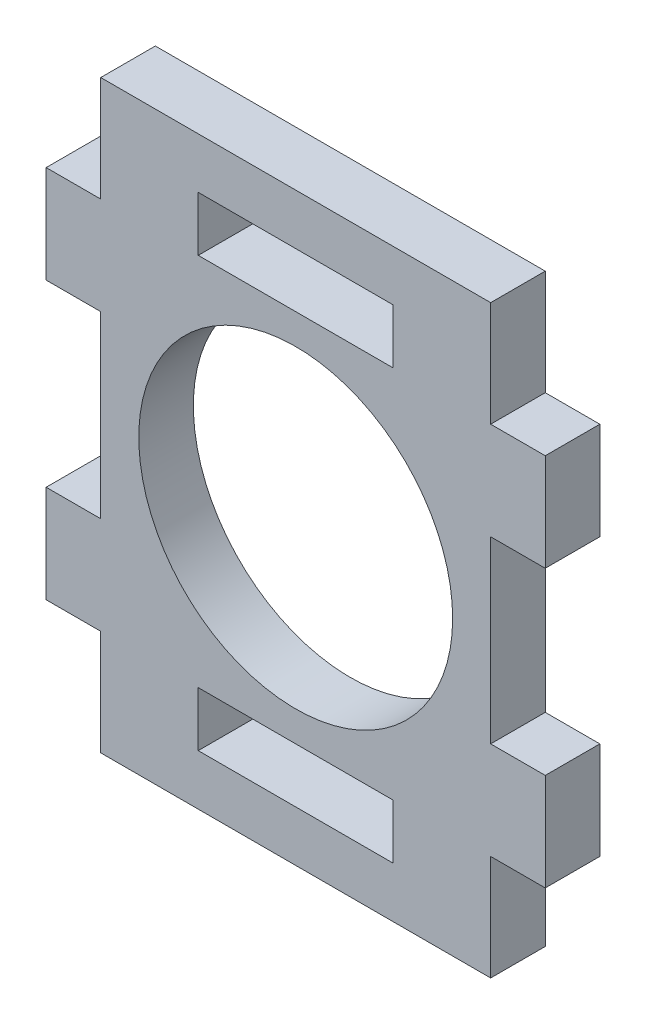
ISO-10303-21;
HEADER;
FILE_DESCRIPTION(('STEP AP214'),'2;1');
FILE_NAME('part.step','',(''),(''),'','','');
FILE_SCHEMA(('AUTOMOTIVE_DESIGN { 1 0 10303 214 1 1 1 1 }'));
ENDSEC;
DATA;
#1=APPLICATION_CONTEXT('core data for automotive mechanical design processes');
#2=APPLICATION_PROTOCOL_DEFINITION('international standard','automotive_design',2000,#1);
#3=PRODUCT_CONTEXT('',#1,'mechanical');
#4=PRODUCT('Part','Part','',(#3));
#5=PRODUCT_RELATED_PRODUCT_CATEGORY('part','',(#4));
#6=PRODUCT_DEFINITION_FORMATION('','',#4);
#7=PRODUCT_DEFINITION_CONTEXT('part definition',#1,'design');
#8=PRODUCT_DEFINITION('design','',#6,#7);
#9=PRODUCT_DEFINITION_SHAPE('','',#8);
#10=(LENGTH_UNIT() NAMED_UNIT(*) SI_UNIT(.MILLI.,.METRE.));
#11=(NAMED_UNIT(*) PLANE_ANGLE_UNIT() SI_UNIT($,.RADIAN.));
#12=(NAMED_UNIT(*) SI_UNIT($,.STERADIAN.) SOLID_ANGLE_UNIT());
#13=UNCERTAINTY_MEASURE_WITH_UNIT(LENGTH_MEASURE(1.E-05),#10,'distance_accuracy_value','');
#14=(GEOMETRIC_REPRESENTATION_CONTEXT(3) GLOBAL_UNCERTAINTY_ASSIGNED_CONTEXT((#13)) GLOBAL_UNIT_ASSIGNED_CONTEXT((#10,
#11,#12)) REPRESENTATION_CONTEXT('',''));
#15=CARTESIAN_POINT('',(0.,0.,0.));
#16=DIRECTION('',(0.,0.,1.));
#17=DIRECTION('',(1.,0.,0.));
#18=AXIS2_PLACEMENT_3D('',#15,#16,#17);
#19=CARTESIAN_POINT('',(0.,0.,1.4));
#20=DIRECTION('',(0.,0.,-1.));
#21=DIRECTION('',(-1.,0.,0.));
#22=AXIS2_PLACEMENT_3D('',#19,#20,#21);
#23=PLANE('',#22);
#24=DIRECTION('',(0.,-1.,0.));
#25=VECTOR('',#24,1.);
#26=CARTESIAN_POINT('',(-5.,9.6,1.4));
#27=LINE('',#26,#25);
#28=CARTESIAN_POINT('',(-5.,12.4,1.4));
#29=VERTEX_POINT('',#28);
#30=CARTESIAN_POINT('',(-5.,9.6,1.4));
#31=VERTEX_POINT('',#30);
#32=EDGE_CURVE('E252',#29,#31,#27,.T.);
#33=ORIENTED_EDGE('',*,*,#32,.F.);
#34=DIRECTION('',(-1.,0.,0.));
#35=VECTOR('',#34,1.);
#36=CARTESIAN_POINT('',(5.,12.4,1.4));
#37=LINE('',#36,#35);
#38=CARTESIAN_POINT('',(5.,12.4,1.4));
#39=VERTEX_POINT('',#38);
#40=EDGE_CURVE('E260',#39,#29,#37,.T.);
#41=ORIENTED_EDGE('',*,*,#40,.F.);
#42=DIRECTION('',(0.,1.,0.));
#43=VECTOR('',#42,1.);
#44=CARTESIAN_POINT('',(5.,9.6,1.4));
#45=LINE('',#44,#43);
#46=CARTESIAN_POINT('',(5.,9.6,1.4));
#47=VERTEX_POINT('',#46);
#48=EDGE_CURVE('E257',#47,#39,#45,.T.);
#49=ORIENTED_EDGE('',*,*,#48,.F.);
#50=DIRECTION('',(1.,0.,0.));
#51=VECTOR('',#50,1.);
#52=CARTESIAN_POINT('',(5.,9.6,1.4));
#53=LINE('',#52,#51);
#54=EDGE_CURVE('E254',#31,#47,#53,.T.);
#55=ORIENTED_EDGE('',*,*,#54,.F.);
#56=EDGE_LOOP('',(#33,#41,#49,#55));
#57=FACE_BOUND('',#56,.T.);
#58=DIRECTION('',(0.,1.,0.));
#59=VECTOR('',#58,1.);
#60=CARTESIAN_POINT('',(10.,9.6,1.4));
#61=LINE('',#60,#59);
#62=CARTESIAN_POINT('',(10.,9.6,1.4));
#63=VERTEX_POINT('',#62);
#64=CARTESIAN_POINT('',(10.,15.,1.4));
#65=VERTEX_POINT('',#64);
#66=EDGE_CURVE('E289',#63,#65,#61,.T.);
#67=ORIENTED_EDGE('',*,*,#66,.T.);
#68=DIRECTION('',(-1.,0.,0.));
#69=VECTOR('',#68,1.);
#70=CARTESIAN_POINT('',(-10.,15.,1.4));
#71=LINE('',#70,#69);
#72=CARTESIAN_POINT('',(-10.,15.,1.4));
#73=VERTEX_POINT('',#72);
#74=EDGE_CURVE('E292',#65,#73,#71,.T.);
#75=ORIENTED_EDGE('',*,*,#74,.T.);
#76=DIRECTION('',(0.,-1.,0.));
#77=VECTOR('',#76,1.);
#78=CARTESIAN_POINT('',(-10.,9.6,1.4));
#79=LINE('',#78,#77);
#80=CARTESIAN_POINT('',(-10.,9.6,1.4));
#81=VERTEX_POINT('',#80);
#82=EDGE_CURVE('E295',#73,#81,#79,.T.);
#83=ORIENTED_EDGE('',*,*,#82,.T.);
#84=DIRECTION('',(-1.,0.,0.));
#85=VECTOR('',#84,1.);
#86=CARTESIAN_POINT('',(-10.,9.6,1.4));
#87=LINE('',#86,#85);
#88=CARTESIAN_POINT('',(-12.8,9.6,1.4));
#89=VERTEX_POINT('',#88);
#90=EDGE_CURVE('E297',#81,#89,#87,.T.);
#91=ORIENTED_EDGE('',*,*,#90,.T.);
#92=DIRECTION('',(0.,-1.,0.));
#93=VECTOR('',#92,1.);
#94=CARTESIAN_POINT('',(-12.8,9.6,1.4));
#95=LINE('',#94,#93);
#96=CARTESIAN_POINT('',(-12.8,4.6,1.4));
#97=VERTEX_POINT('',#96);
#98=EDGE_CURVE('E299',#89,#97,#95,.T.);
#99=ORIENTED_EDGE('',*,*,#98,.T.);
#100=DIRECTION('',(1.,0.,0.));
#101=VECTOR('',#100,1.);
#102=CARTESIAN_POINT('',(-12.8,4.6,1.4));
#103=LINE('',#102,#101);
#104=CARTESIAN_POINT('',(-10.,4.6,1.4));
#105=VERTEX_POINT('',#104);
#106=EDGE_CURVE('E301',#97,#105,#103,.T.);
#107=ORIENTED_EDGE('',*,*,#106,.T.);
#108=DIRECTION('',(0.,-1.,0.));
#109=VECTOR('',#108,1.);
#110=CARTESIAN_POINT('',(-10.,-4.6,1.4));
#111=LINE('',#110,#109);
#112=CARTESIAN_POINT('',(-10.,-4.6,1.4));
#113=VERTEX_POINT('',#112);
#114=EDGE_CURVE('E303',#105,#113,#111,.T.);
#115=ORIENTED_EDGE('',*,*,#114,.T.);
#116=DIRECTION('',(-1.,0.,0.));
#117=VECTOR('',#116,1.);
#118=CARTESIAN_POINT('',(-12.8,-4.6,1.4));
#119=LINE('',#118,#117);
#120=CARTESIAN_POINT('',(-12.8,-4.6,1.4));
#121=VERTEX_POINT('',#120);
#122=EDGE_CURVE('E305',#113,#121,#119,.T.);
#123=ORIENTED_EDGE('',*,*,#122,.T.);
#124=DIRECTION('',(0.,-1.,0.));
#125=VECTOR('',#124,1.);
#126=CARTESIAN_POINT('',(-12.8,-9.60000000000001,1.4));
#127=LINE('',#126,#125);
#128=CARTESIAN_POINT('',(-12.8,-9.60000000000001,1.4));
#129=VERTEX_POINT('',#128);
#130=EDGE_CURVE('E307',#121,#129,#127,.T.);
#131=ORIENTED_EDGE('',*,*,#130,.T.);
#132=DIRECTION('',(1.,0.,0.));
#133=VECTOR('',#132,1.);
#134=CARTESIAN_POINT('',(-10.,-9.6,1.4));
#135=LINE('',#134,#133);
#136=CARTESIAN_POINT('',(-10.,-9.6,1.4));
#137=VERTEX_POINT('',#136);
#138=EDGE_CURVE('E309',#129,#137,#135,.T.);
#139=ORIENTED_EDGE('',*,*,#138,.T.);
#140=DIRECTION('',(0.,-1.,0.));
#141=VECTOR('',#140,1.);
#142=CARTESIAN_POINT('',(-10.,-15.,1.4));
#143=LINE('',#142,#141);
#144=CARTESIAN_POINT('',(-10.,-15.,1.4));
#145=VERTEX_POINT('',#144);
#146=EDGE_CURVE('E311',#137,#145,#143,.T.);
#147=ORIENTED_EDGE('',*,*,#146,.T.);
#148=DIRECTION('',(1.,0.,0.));
#149=VECTOR('',#148,1.);
#150=CARTESIAN_POINT('',(-10.,-15.,1.4));
#151=LINE('',#150,#149);
#152=CARTESIAN_POINT('',(10.,-15.,1.4));
#153=VERTEX_POINT('',#152);
#154=EDGE_CURVE('E313',#145,#153,#151,.T.);
#155=ORIENTED_EDGE('',*,*,#154,.T.);
#156=DIRECTION('',(0.,1.,0.));
#157=VECTOR('',#156,1.);
#158=CARTESIAN_POINT('',(10.,-15.,1.4));
#159=LINE('',#158,#157);
#160=CARTESIAN_POINT('',(10.,-9.6,1.4));
#161=VERTEX_POINT('',#160);
#162=EDGE_CURVE('E315',#153,#161,#159,.T.);
#163=ORIENTED_EDGE('',*,*,#162,.T.);
#164=DIRECTION('',(1.,0.,0.));
#165=VECTOR('',#164,1.);
#166=CARTESIAN_POINT('',(10.,-9.6,1.4));
#167=LINE('',#166,#165);
#168=CARTESIAN_POINT('',(12.8,-9.6,1.4));
#169=VERTEX_POINT('',#168);
#170=EDGE_CURVE('E317',#161,#169,#167,.T.);
#171=ORIENTED_EDGE('',*,*,#170,.T.);
#172=DIRECTION('',(0.,1.,0.));
#173=VECTOR('',#172,1.);
#174=CARTESIAN_POINT('',(12.8,-9.6,1.4));
#175=LINE('',#174,#173);
#176=CARTESIAN_POINT('',(12.8,-4.6,1.4));
#177=VERTEX_POINT('',#176);
#178=EDGE_CURVE('E319',#169,#177,#175,.T.);
#179=ORIENTED_EDGE('',*,*,#178,.T.);
#180=DIRECTION('',(-1.,0.,0.));
#181=VECTOR('',#180,1.);
#182=CARTESIAN_POINT('',(12.8,-4.6,1.4));
#183=LINE('',#182,#181);
#184=CARTESIAN_POINT('',(10.,-4.6,1.4));
#185=VERTEX_POINT('',#184);
#186=EDGE_CURVE('E321',#177,#185,#183,.T.);
#187=ORIENTED_EDGE('',*,*,#186,.T.);
#188=DIRECTION('',(0.,1.,0.));
#189=VECTOR('',#188,1.);
#190=CARTESIAN_POINT('',(10.,-4.6,1.4));
#191=LINE('',#190,#189);
#192=CARTESIAN_POINT('',(10.,4.6,1.4));
#193=VERTEX_POINT('',#192);
#194=EDGE_CURVE('E323',#185,#193,#191,.T.);
#195=ORIENTED_EDGE('',*,*,#194,.T.);
#196=DIRECTION('',(1.,0.,0.));
#197=VECTOR('',#196,1.);
#198=CARTESIAN_POINT('',(12.8,4.6,1.4));
#199=LINE('',#198,#197);
#200=CARTESIAN_POINT('',(12.8,4.6,1.4));
#201=VERTEX_POINT('',#200);
#202=EDGE_CURVE('E325',#193,#201,#199,.T.);
#203=ORIENTED_EDGE('',*,*,#202,.T.);
#204=DIRECTION('',(0.,1.,0.));
#205=VECTOR('',#204,1.);
#206=CARTESIAN_POINT('',(12.8,9.6,1.4));
#207=LINE('',#206,#205);
#208=CARTESIAN_POINT('',(12.8,9.6,1.4));
#209=VERTEX_POINT('',#208);
#210=EDGE_CURVE('E327',#201,#209,#207,.T.);
#211=ORIENTED_EDGE('',*,*,#210,.T.);
#212=DIRECTION('',(-1.,0.,0.));
#213=VECTOR('',#212,1.);
#214=CARTESIAN_POINT('',(10.,9.6,1.4));
#215=LINE('',#214,#213);
#216=EDGE_CURVE('E329',#209,#63,#215,.T.);
#217=ORIENTED_EDGE('',*,*,#216,.T.);
#218=EDGE_LOOP('',(#67,#75,#83,#91,#99,#107,#115,#123,#131,#139,#147,#155,#163,#171,#179,#187,
#195,#203,#211,#217));
#219=FACE_BOUND('',#218,.T.);
#220=CARTESIAN_POINT('',(0.,0.,1.4));
#221=DIRECTION('',(0.,0.,1.));
#222=DIRECTION('',(1.,0.,0.));
#223=AXIS2_PLACEMENT_3D('',#220,#221,#222);
#224=CIRCLE('',#223,8.05);
#225=CARTESIAN_POINT('',(8.05,0.,1.4));
#226=VERTEX_POINT('',#225);
#227=EDGE_CURVE('E283',#226,#226,#224,.T.);
#228=ORIENTED_EDGE('',*,*,#227,.F.);
#229=EDGE_LOOP('',(#228));
#230=FACE_BOUND('',#229,.T.);
#231=DIRECTION('',(0.,1.,0.));
#232=VECTOR('',#231,1.);
#233=CARTESIAN_POINT('',(4.99999999999998,-9.6,1.4));
#234=LINE('',#233,#232);
#235=CARTESIAN_POINT('',(4.99999999999998,-12.4,1.4));
#236=VERTEX_POINT('',#235);
#237=CARTESIAN_POINT('',(4.99999999999998,-9.6,1.4));
#238=VERTEX_POINT('',#237);
#239=EDGE_CURVE('E216',#236,#238,#234,.T.);
#240=ORIENTED_EDGE('',*,*,#239,.F.);
#241=DIRECTION('',(1.,0.,0.));
#242=VECTOR('',#241,1.);
#243=CARTESIAN_POINT('',(4.99999999999998,-12.4,1.4));
#244=LINE('',#243,#242);
#245=CARTESIAN_POINT('',(-5.00000000000002,-12.4,1.4));
#246=VERTEX_POINT('',#245);
#247=EDGE_CURVE('E238',#246,#236,#244,.T.);
#248=ORIENTED_EDGE('',*,*,#247,.F.);
#249=DIRECTION('',(0.,-1.,0.));
#250=VECTOR('',#249,1.);
#251=CARTESIAN_POINT('',(-5.00000000000002,-9.6,1.4));
#252=LINE('',#251,#250);
#253=CARTESIAN_POINT('',(-5.00000000000002,-9.6,1.4));
#254=VERTEX_POINT('',#253);
#255=EDGE_CURVE('E236',#254,#246,#252,.T.);
#256=ORIENTED_EDGE('',*,*,#255,.F.);
#257=DIRECTION('',(-1.,0.,0.));
#258=VECTOR('',#257,1.);
#259=CARTESIAN_POINT('',(4.99999999999998,-9.6,1.4));
#260=LINE('',#259,#258);
#261=EDGE_CURVE('E224',#238,#254,#260,.T.);
#262=ORIENTED_EDGE('',*,*,#261,.F.);
#263=EDGE_LOOP('',(#240,#248,#256,#262));
#264=FACE_BOUND('',#263,.T.);
#265=ADVANCED_FACE('F31',(#57,#219,#230,#264),#23,.F.);
#266=CARTESIAN_POINT('',(0.,0.,-1.4));
#267=DIRECTION('',(0.,0.,-1.));
#268=DIRECTION('',(-1.,0.,0.));
#269=AXIS2_PLACEMENT_3D('',#266,#267,#268);
#270=PLANE('',#269);
#271=DIRECTION('',(0.,1.,0.));
#272=VECTOR('',#271,1.);
#273=CARTESIAN_POINT('',(10.,9.6,-1.4));
#274=LINE('',#273,#272);
#275=CARTESIAN_POINT('',(10.,9.6,-1.4));
#276=VERTEX_POINT('',#275);
#277=CARTESIAN_POINT('',(10.,15.,-1.4));
#278=VERTEX_POINT('',#277);
#279=EDGE_CURVE('E286',#276,#278,#274,.T.);
#280=ORIENTED_EDGE('',*,*,#279,.F.);
#281=DIRECTION('',(-1.,0.,0.));
#282=VECTOR('',#281,1.);
#283=CARTESIAN_POINT('',(10.,9.6,-1.4));
#284=LINE('',#283,#282);
#285=CARTESIAN_POINT('',(12.8,9.6,-1.4));
#286=VERTEX_POINT('',#285);
#287=EDGE_CURVE('E293',#286,#276,#284,.T.);
#288=ORIENTED_EDGE('',*,*,#287,.F.);
#289=DIRECTION('',(0.,1.,0.));
#290=VECTOR('',#289,1.);
#291=CARTESIAN_POINT('',(12.8,9.6,-1.4));
#292=LINE('',#291,#290);
#293=CARTESIAN_POINT('',(12.8,4.6,-1.4));
#294=VERTEX_POINT('',#293);
#295=EDGE_CURVE('E368',#294,#286,#292,.T.);
#296=ORIENTED_EDGE('',*,*,#295,.F.);
#297=DIRECTION('',(1.,0.,0.));
#298=VECTOR('',#297,1.);
#299=CARTESIAN_POINT('',(12.8,4.6,-1.4));
#300=LINE('',#299,#298);
#301=CARTESIAN_POINT('',(10.,4.6,-1.4));
#302=VERTEX_POINT('',#301);
#303=EDGE_CURVE('E366',#302,#294,#300,.T.);
#304=ORIENTED_EDGE('',*,*,#303,.F.);
#305=DIRECTION('',(0.,1.,0.));
#306=VECTOR('',#305,1.);
#307=CARTESIAN_POINT('',(10.,-4.6,-1.4));
#308=LINE('',#307,#306);
#309=CARTESIAN_POINT('',(10.,-4.6,-1.4));
#310=VERTEX_POINT('',#309);
#311=EDGE_CURVE('E364',#310,#302,#308,.T.);
#312=ORIENTED_EDGE('',*,*,#311,.F.);
#313=DIRECTION('',(-1.,0.,0.));
#314=VECTOR('',#313,1.);
#315=CARTESIAN_POINT('',(12.8,-4.6,-1.4));
#316=LINE('',#315,#314);
#317=CARTESIAN_POINT('',(12.8,-4.6,-1.4));
#318=VERTEX_POINT('',#317);
#319=EDGE_CURVE('E362',#318,#310,#316,.T.);
#320=ORIENTED_EDGE('',*,*,#319,.F.);
#321=DIRECTION('',(0.,1.,0.));
#322=VECTOR('',#321,1.);
#323=CARTESIAN_POINT('',(12.8,-9.6,-1.4));
#324=LINE('',#323,#322);
#325=CARTESIAN_POINT('',(12.8,-9.6,-1.4));
#326=VERTEX_POINT('',#325);
#327=EDGE_CURVE('E360',#326,#318,#324,.T.);
#328=ORIENTED_EDGE('',*,*,#327,.F.);
#329=DIRECTION('',(1.,0.,0.));
#330=VECTOR('',#329,1.);
#331=CARTESIAN_POINT('',(10.,-9.6,-1.4));
#332=LINE('',#331,#330);
#333=CARTESIAN_POINT('',(10.,-9.6,-1.4));
#334=VERTEX_POINT('',#333);
#335=EDGE_CURVE('E358',#334,#326,#332,.T.);
#336=ORIENTED_EDGE('',*,*,#335,.F.);
#337=DIRECTION('',(0.,1.,0.));
#338=VECTOR('',#337,1.);
#339=CARTESIAN_POINT('',(10.,-15.,-1.4));
#340=LINE('',#339,#338);
#341=CARTESIAN_POINT('',(10.,-15.,-1.4));
#342=VERTEX_POINT('',#341);
#343=EDGE_CURVE('E356',#342,#334,#340,.T.);
#344=ORIENTED_EDGE('',*,*,#343,.F.);
#345=DIRECTION('',(1.,0.,0.));
#346=VECTOR('',#345,1.);
#347=CARTESIAN_POINT('',(-10.,-15.,-1.4));
#348=LINE('',#347,#346);
#349=CARTESIAN_POINT('',(-10.,-15.,-1.4));
#350=VERTEX_POINT('',#349);
#351=EDGE_CURVE('E354',#350,#342,#348,.T.);
#352=ORIENTED_EDGE('',*,*,#351,.F.);
#353=DIRECTION('',(0.,-1.,0.));
#354=VECTOR('',#353,1.);
#355=CARTESIAN_POINT('',(-10.,-15.,-1.4));
#356=LINE('',#355,#354);
#357=CARTESIAN_POINT('',(-10.,-9.6,-1.4));
#358=VERTEX_POINT('',#357);
#359=EDGE_CURVE('E352',#358,#350,#356,.T.);
#360=ORIENTED_EDGE('',*,*,#359,.F.);
#361=DIRECTION('',(1.,0.,0.));
#362=VECTOR('',#361,1.);
#363=CARTESIAN_POINT('',(-10.,-9.6,-1.4));
#364=LINE('',#363,#362);
#365=CARTESIAN_POINT('',(-12.8,-9.60000000000001,-1.4));
#366=VERTEX_POINT('',#365);
#367=EDGE_CURVE('E350',#366,#358,#364,.T.);
#368=ORIENTED_EDGE('',*,*,#367,.F.);
#369=DIRECTION('',(0.,-1.,0.));
#370=VECTOR('',#369,1.);
#371=CARTESIAN_POINT('',(-12.8,-9.60000000000001,-1.4));
#372=LINE('',#371,#370);
#373=CARTESIAN_POINT('',(-12.8,-4.6,-1.4));
#374=VERTEX_POINT('',#373);
#375=EDGE_CURVE('E348',#374,#366,#372,.T.);
#376=ORIENTED_EDGE('',*,*,#375,.F.);
#377=DIRECTION('',(-1.,0.,0.));
#378=VECTOR('',#377,1.);
#379=CARTESIAN_POINT('',(-12.8,-4.6,-1.4));
#380=LINE('',#379,#378);
#381=CARTESIAN_POINT('',(-10.,-4.6,-1.4));
#382=VERTEX_POINT('',#381);
#383=EDGE_CURVE('E346',#382,#374,#380,.T.);
#384=ORIENTED_EDGE('',*,*,#383,.F.);
#385=DIRECTION('',(0.,-1.,0.));
#386=VECTOR('',#385,1.);
#387=CARTESIAN_POINT('',(-10.,-4.6,-1.4));
#388=LINE('',#387,#386);
#389=CARTESIAN_POINT('',(-10.,4.6,-1.4));
#390=VERTEX_POINT('',#389);
#391=EDGE_CURVE('E344',#390,#382,#388,.T.);
#392=ORIENTED_EDGE('',*,*,#391,.F.);
#393=DIRECTION('',(1.,0.,0.));
#394=VECTOR('',#393,1.);
#395=CARTESIAN_POINT('',(-12.8,4.6,-1.4));
#396=LINE('',#395,#394);
#397=CARTESIAN_POINT('',(-12.8,4.6,-1.4));
#398=VERTEX_POINT('',#397);
#399=EDGE_CURVE('E342',#398,#390,#396,.T.);
#400=ORIENTED_EDGE('',*,*,#399,.F.);
#401=DIRECTION('',(0.,-1.,0.));
#402=VECTOR('',#401,1.);
#403=CARTESIAN_POINT('',(-12.8,9.6,-1.4));
#404=LINE('',#403,#402);
#405=CARTESIAN_POINT('',(-12.8,9.6,-1.4));
#406=VERTEX_POINT('',#405);
#407=EDGE_CURVE('E340',#406,#398,#404,.T.);
#408=ORIENTED_EDGE('',*,*,#407,.F.);
#409=DIRECTION('',(-1.,0.,0.));
#410=VECTOR('',#409,1.);
#411=CARTESIAN_POINT('',(-10.,9.6,-1.4));
#412=LINE('',#411,#410);
#413=CARTESIAN_POINT('',(-10.,9.6,-1.4));
#414=VERTEX_POINT('',#413);
#415=EDGE_CURVE('E338',#414,#406,#412,.T.);
#416=ORIENTED_EDGE('',*,*,#415,.F.);
#417=DIRECTION('',(0.,-1.,0.));
#418=VECTOR('',#417,1.);
#419=CARTESIAN_POINT('',(-10.,9.6,-1.4));
#420=LINE('',#419,#418);
#421=CARTESIAN_POINT('',(-10.,15.,-1.4));
#422=VERTEX_POINT('',#421);
#423=EDGE_CURVE('E336',#422,#414,#420,.T.);
#424=ORIENTED_EDGE('',*,*,#423,.F.);
#425=DIRECTION('',(-1.,0.,0.));
#426=VECTOR('',#425,1.);
#427=CARTESIAN_POINT('',(-10.,15.,-1.4));
#428=LINE('',#427,#426);
#429=EDGE_CURVE('E334',#278,#422,#428,.T.);
#430=ORIENTED_EDGE('',*,*,#429,.F.);
#431=EDGE_LOOP('',(#280,#288,#296,#304,#312,#320,#328,#336,#344,#352,#360,#368,#376,#384,#392,
#400,#408,#416,#424,#430));
#432=FACE_BOUND('',#431,.T.);
#433=CARTESIAN_POINT('',(0.,0.,-1.4));
#434=DIRECTION('',(0.,0.,1.));
#435=DIRECTION('',(1.,0.,0.));
#436=AXIS2_PLACEMENT_3D('',#433,#434,#435);
#437=CIRCLE('',#436,8.05);
#438=CARTESIAN_POINT('',(8.05,0.,-1.4));
#439=VERTEX_POINT('',#438);
#440=EDGE_CURVE('E282',#439,#439,#437,.T.);
#441=ORIENTED_EDGE('',*,*,#440,.T.);
#442=EDGE_LOOP('',(#441));
#443=FACE_BOUND('',#442,.T.);
#444=DIRECTION('',(-1.,0.,0.));
#445=VECTOR('',#444,1.);
#446=CARTESIAN_POINT('',(5.,12.4,-1.4));
#447=LINE('',#446,#445);
#448=CARTESIAN_POINT('',(5.,12.4,-1.4));
#449=VERTEX_POINT('',#448);
#450=CARTESIAN_POINT('',(-5.,12.4,-1.4));
#451=VERTEX_POINT('',#450);
#452=EDGE_CURVE('E255',#449,#451,#447,.T.);
#453=ORIENTED_EDGE('',*,*,#452,.T.);
#454=DIRECTION('',(0.,-1.,0.));
#455=VECTOR('',#454,1.);
#456=CARTESIAN_POINT('',(-5.,9.6,-1.4));
#457=LINE('',#456,#455);
#458=CARTESIAN_POINT('',(-5.,9.6,-1.4));
#459=VERTEX_POINT('',#458);
#460=EDGE_CURVE('E232',#451,#459,#457,.T.);
#461=ORIENTED_EDGE('',*,*,#460,.T.);
#462=DIRECTION('',(1.,0.,0.));
#463=VECTOR('',#462,1.);
#464=CARTESIAN_POINT('',(5.,9.6,-1.4));
#465=LINE('',#464,#463);
#466=CARTESIAN_POINT('',(5.,9.6,-1.4));
#467=VERTEX_POINT('',#466);
#468=EDGE_CURVE('E265',#459,#467,#465,.T.);
#469=ORIENTED_EDGE('',*,*,#468,.T.);
#470=DIRECTION('',(0.,1.,0.));
#471=VECTOR('',#470,1.);
#472=CARTESIAN_POINT('',(5.,9.6,-1.4));
#473=LINE('',#472,#471);
#474=EDGE_CURVE('E268',#467,#449,#473,.T.);
#475=ORIENTED_EDGE('',*,*,#474,.T.);
#476=EDGE_LOOP('',(#453,#461,#469,#475));
#477=FACE_BOUND('',#476,.T.);
#478=DIRECTION('',(1.,0.,0.));
#479=VECTOR('',#478,1.);
#480=CARTESIAN_POINT('',(4.99999999999998,-12.4,-1.4));
#481=LINE('',#480,#479);
#482=CARTESIAN_POINT('',(-5.00000000000002,-12.4,-1.4));
#483=VERTEX_POINT('',#482);
#484=CARTESIAN_POINT('',(4.99999999999998,-12.4,-1.4));
#485=VERTEX_POINT('',#484);
#486=EDGE_CURVE('E225',#483,#485,#481,.T.);
#487=ORIENTED_EDGE('',*,*,#486,.T.);
#488=DIRECTION('',(0.,1.,0.));
#489=VECTOR('',#488,1.);
#490=CARTESIAN_POINT('',(4.99999999999998,-9.6,-1.4));
#491=LINE('',#490,#489);
#492=CARTESIAN_POINT('',(4.99999999999998,-9.6,-1.4));
#493=VERTEX_POINT('',#492);
#494=EDGE_CURVE('E54',#485,#493,#491,.T.);
#495=ORIENTED_EDGE('',*,*,#494,.T.);
#496=DIRECTION('',(-1.,0.,0.));
#497=VECTOR('',#496,1.);
#498=CARTESIAN_POINT('',(4.99999999999998,-9.6,-1.4));
#499=LINE('',#498,#497);
#500=CARTESIAN_POINT('',(-5.00000000000002,-9.6,-1.4));
#501=VERTEX_POINT('',#500);
#502=EDGE_CURVE('E231',#493,#501,#499,.T.);
#503=ORIENTED_EDGE('',*,*,#502,.T.);
#504=DIRECTION('',(0.,-1.,0.));
#505=VECTOR('',#504,1.);
#506=CARTESIAN_POINT('',(-5.00000000000002,-9.6,-1.4));
#507=LINE('',#506,#505);
#508=EDGE_CURVE('E244',#501,#483,#507,.T.);
#509=ORIENTED_EDGE('',*,*,#508,.T.);
#510=EDGE_LOOP('',(#487,#495,#503,#509));
#511=FACE_BOUND('',#510,.T.);
#512=ADVANCED_FACE('F434',(#432,#443,#477,#511),#270,.T.);
#513=CARTESIAN_POINT('',(10.,9.6,1.4));
#514=DIRECTION('',(-1.,0.,0.));
#515=DIRECTION('',(0.,-1.,0.));
#516=AXIS2_PLACEMENT_3D('',#513,#514,#515);
#517=PLANE('',#516);
#518=ORIENTED_EDGE('',*,*,#279,.T.);
#519=DIRECTION('',(0.,0.,-1.));
#520=VECTOR('',#519,1.);
#521=CARTESIAN_POINT('',(10.,15.,1.4));
#522=LINE('',#521,#520);
#523=EDGE_CURVE('E11',#65,#278,#522,.T.);
#524=ORIENTED_EDGE('',*,*,#523,.F.);
#525=ORIENTED_EDGE('',*,*,#66,.F.);
#526=DIRECTION('',(0.,0.,-1.));
#527=VECTOR('',#526,1.);
#528=CARTESIAN_POINT('',(10.,9.6,1.4));
#529=LINE('',#528,#527);
#530=EDGE_CURVE('E331',#63,#276,#529,.T.);
#531=ORIENTED_EDGE('',*,*,#530,.T.);
#532=EDGE_LOOP('',(#518,#524,#525,#531));
#533=FACE_BOUND('',#532,.T.);
#534=ADVANCED_FACE('F33',(#533),#517,.F.);
#535=CARTESIAN_POINT('',(-10.,15.,1.4));
#536=DIRECTION('',(0.,-1.,0.));
#537=DIRECTION('',(0.,0.,-1.));
#538=AXIS2_PLACEMENT_3D('',#535,#536,#537);
#539=PLANE('',#538);
#540=ORIENTED_EDGE('',*,*,#429,.T.);
#541=DIRECTION('',(0.,0.,-1.));
#542=VECTOR('',#541,1.);
#543=CARTESIAN_POINT('',(-10.,15.,1.4));
#544=LINE('',#543,#542);
#545=EDGE_CURVE('E39',#73,#422,#544,.T.);
#546=ORIENTED_EDGE('',*,*,#545,.F.);
#547=ORIENTED_EDGE('',*,*,#74,.F.);
#548=ORIENTED_EDGE('',*,*,#523,.T.);
#549=EDGE_LOOP('',(#540,#546,#547,#548));
#550=FACE_BOUND('',#549,.T.);
#551=ADVANCED_FACE('F452',(#550),#539,.F.);
#552=CARTESIAN_POINT('',(-10.,9.6,1.4));
#553=DIRECTION('',(1.,0.,0.));
#554=DIRECTION('',(0.,1.,0.));
#555=AXIS2_PLACEMENT_3D('',#552,#553,#554);
#556=PLANE('',#555);
#557=ORIENTED_EDGE('',*,*,#423,.T.);
#558=DIRECTION('',(0.,0.,-1.));
#559=VECTOR('',#558,1.);
#560=CARTESIAN_POINT('',(-10.,9.6,1.4));
#561=LINE('',#560,#559);
#562=EDGE_CURVE('E421',#81,#414,#561,.T.);
#563=ORIENTED_EDGE('',*,*,#562,.F.);
#564=ORIENTED_EDGE('',*,*,#82,.F.);
#565=ORIENTED_EDGE('',*,*,#545,.T.);
#566=EDGE_LOOP('',(#557,#563,#564,#565));
#567=FACE_BOUND('',#566,.T.);
#568=ADVANCED_FACE('F428',(#567),#556,.F.);
#569=CARTESIAN_POINT('',(-10.,9.6,1.4));
#570=DIRECTION('',(0.,-1.,0.));
#571=DIRECTION('',(0.,0.,-1.));
#572=AXIS2_PLACEMENT_3D('',#569,#570,#571);
#573=PLANE('',#572);
#574=ORIENTED_EDGE('',*,*,#415,.T.);
#575=DIRECTION('',(0.,0.,-1.));
#576=VECTOR('',#575,1.);
#577=CARTESIAN_POINT('',(-12.8,9.6,1.4));
#578=LINE('',#577,#576);
#579=EDGE_CURVE('E418',#89,#406,#578,.T.);
#580=ORIENTED_EDGE('',*,*,#579,.F.);
#581=ORIENTED_EDGE('',*,*,#90,.F.);
#582=ORIENTED_EDGE('',*,*,#562,.T.);
#583=EDGE_LOOP('',(#574,#580,#581,#582));
#584=FACE_BOUND('',#583,.T.);
#585=ADVANCED_FACE('F440',(#584),#573,.F.);
#586=CARTESIAN_POINT('',(-12.8,9.6,1.4));
#587=DIRECTION('',(1.,0.,0.));
#588=DIRECTION('',(0.,1.,0.));
#589=AXIS2_PLACEMENT_3D('',#586,#587,#588);
#590=PLANE('',#589);
#591=ORIENTED_EDGE('',*,*,#407,.T.);
#592=DIRECTION('',(0.,0.,-1.));
#593=VECTOR('',#592,1.);
#594=CARTESIAN_POINT('',(-12.8,4.6,1.4));
#595=LINE('',#594,#593);
#596=EDGE_CURVE('E415',#97,#398,#595,.T.);
#597=ORIENTED_EDGE('',*,*,#596,.F.);
#598=ORIENTED_EDGE('',*,*,#98,.F.);
#599=ORIENTED_EDGE('',*,*,#579,.T.);
#600=EDGE_LOOP('',(#591,#597,#598,#599));
#601=FACE_BOUND('',#600,.T.);
#602=ADVANCED_FACE('F444',(#601),#590,.F.);
#603=CARTESIAN_POINT('',(-12.8,4.6,1.4));
#604=DIRECTION('',(0.,1.,0.));
#605=DIRECTION('',(-1.,0.,0.));
#606=AXIS2_PLACEMENT_3D('',#603,#604,#605);
#607=PLANE('',#606);
#608=ORIENTED_EDGE('',*,*,#399,.T.);
#609=DIRECTION('',(0.,0.,-1.));
#610=VECTOR('',#609,1.);
#611=CARTESIAN_POINT('',(-10.,4.6,1.4));
#612=LINE('',#611,#610);
#613=EDGE_CURVE('E412',#105,#390,#612,.T.);
#614=ORIENTED_EDGE('',*,*,#613,.F.);
#615=ORIENTED_EDGE('',*,*,#106,.F.);
#616=ORIENTED_EDGE('',*,*,#596,.T.);
#617=EDGE_LOOP('',(#608,#614,#615,#616));
#618=FACE_BOUND('',#617,.T.);
#619=ADVANCED_FACE('F525',(#618),#607,.F.);
#620=CARTESIAN_POINT('',(-10.,-4.6,1.4));
#621=DIRECTION('',(1.,0.,0.));
#622=DIRECTION('',(0.,1.,0.));
#623=AXIS2_PLACEMENT_3D('',#620,#621,#622);
#624=PLANE('',#623);
#625=ORIENTED_EDGE('',*,*,#391,.T.);
#626=DIRECTION('',(0.,0.,-1.));
#627=VECTOR('',#626,1.);
#628=CARTESIAN_POINT('',(-10.,-4.6,1.4));
#629=LINE('',#628,#627);
#630=EDGE_CURVE('E409',#113,#382,#629,.T.);
#631=ORIENTED_EDGE('',*,*,#630,.F.);
#632=ORIENTED_EDGE('',*,*,#114,.F.);
#633=ORIENTED_EDGE('',*,*,#613,.T.);
#634=EDGE_LOOP('',(#625,#631,#632,#633));
#635=FACE_BOUND('',#634,.T.);
#636=ADVANCED_FACE('F523',(#635),#624,.F.);
#637=CARTESIAN_POINT('',(-12.8,-4.6,1.4));
#638=DIRECTION('',(0.,-1.,0.));
#639=DIRECTION('',(1.,0.,0.));
#640=AXIS2_PLACEMENT_3D('',#637,#638,#639);
#641=PLANE('',#640);
#642=ORIENTED_EDGE('',*,*,#383,.T.);
#643=DIRECTION('',(0.,0.,-1.));
#644=VECTOR('',#643,1.);
#645=CARTESIAN_POINT('',(-12.8,-4.6,1.4));
#646=LINE('',#645,#644);
#647=EDGE_CURVE('E406',#121,#374,#646,.T.);
#648=ORIENTED_EDGE('',*,*,#647,.F.);
#649=ORIENTED_EDGE('',*,*,#122,.F.);
#650=ORIENTED_EDGE('',*,*,#630,.T.);
#651=EDGE_LOOP('',(#642,#648,#649,#650));
#652=FACE_BOUND('',#651,.T.);
#653=ADVANCED_FACE('F518',(#652),#641,.F.);
#654=CARTESIAN_POINT('',(-12.8,-9.60000000000001,1.4));
#655=DIRECTION('',(1.,0.,0.));
#656=DIRECTION('',(0.,1.,0.));
#657=AXIS2_PLACEMENT_3D('',#654,#655,#656);
#658=PLANE('',#657);
#659=ORIENTED_EDGE('',*,*,#375,.T.);
#660=DIRECTION('',(0.,0.,-1.));
#661=VECTOR('',#660,1.);
#662=CARTESIAN_POINT('',(-12.8,-9.60000000000001,1.4));
#663=LINE('',#662,#661);
#664=EDGE_CURVE('E403',#129,#366,#663,.T.);
#665=ORIENTED_EDGE('',*,*,#664,.F.);
#666=ORIENTED_EDGE('',*,*,#130,.F.);
#667=ORIENTED_EDGE('',*,*,#647,.T.);
#668=EDGE_LOOP('',(#659,#665,#666,#667));
#669=FACE_BOUND('',#668,.T.);
#670=ADVANCED_FACE('F513',(#669),#658,.F.);
#671=CARTESIAN_POINT('',(-10.,-9.6,1.4));
#672=DIRECTION('',(0.,1.,0.));
#673=DIRECTION('',(-1.,0.,0.));
#674=AXIS2_PLACEMENT_3D('',#671,#672,#673);
#675=PLANE('',#674);
#676=ORIENTED_EDGE('',*,*,#367,.T.);
#677=DIRECTION('',(0.,0.,-1.));
#678=VECTOR('',#677,1.);
#679=CARTESIAN_POINT('',(-10.,-9.6,1.4));
#680=LINE('',#679,#678);
#681=EDGE_CURVE('E400',#137,#358,#680,.T.);
#682=ORIENTED_EDGE('',*,*,#681,.F.);
#683=ORIENTED_EDGE('',*,*,#138,.F.);
#684=ORIENTED_EDGE('',*,*,#664,.T.);
#685=EDGE_LOOP('',(#676,#682,#683,#684));
#686=FACE_BOUND('',#685,.T.);
#687=ADVANCED_FACE('F509',(#686),#675,.F.);
#688=CARTESIAN_POINT('',(-10.,-15.,1.4));
#689=DIRECTION('',(1.,0.,0.));
#690=DIRECTION('',(0.,1.,0.));
#691=AXIS2_PLACEMENT_3D('',#688,#689,#690);
#692=PLANE('',#691);
#693=ORIENTED_EDGE('',*,*,#359,.T.);
#694=DIRECTION('',(0.,0.,-1.));
#695=VECTOR('',#694,1.);
#696=CARTESIAN_POINT('',(-10.,-15.,1.4));
#697=LINE('',#696,#695);
#698=EDGE_CURVE('E397',#145,#350,#697,.T.);
#699=ORIENTED_EDGE('',*,*,#698,.F.);
#700=ORIENTED_EDGE('',*,*,#146,.F.);
#701=ORIENTED_EDGE('',*,*,#681,.T.);
#702=EDGE_LOOP('',(#693,#699,#700,#701));
#703=FACE_BOUND('',#702,.T.);
#704=ADVANCED_FACE('F504',(#703),#692,.F.);
#705=CARTESIAN_POINT('',(-10.,-15.,1.4));
#706=DIRECTION('',(0.,1.,0.));
#707=DIRECTION('',(0.,0.,1.));
#708=AXIS2_PLACEMENT_3D('',#705,#706,#707);
#709=PLANE('',#708);
#710=ORIENTED_EDGE('',*,*,#351,.T.);
#711=DIRECTION('',(0.,0.,-1.));
#712=VECTOR('',#711,1.);
#713=CARTESIAN_POINT('',(10.,-15.,1.4));
#714=LINE('',#713,#712);
#715=EDGE_CURVE('E394',#153,#342,#714,.T.);
#716=ORIENTED_EDGE('',*,*,#715,.F.);
#717=ORIENTED_EDGE('',*,*,#154,.F.);
#718=ORIENTED_EDGE('',*,*,#698,.T.);
#719=EDGE_LOOP('',(#710,#716,#717,#718));
#720=FACE_BOUND('',#719,.T.);
#721=ADVANCED_FACE('F498',(#720),#709,.F.);
#722=CARTESIAN_POINT('',(10.,-15.,1.4));
#723=DIRECTION('',(-1.,0.,0.));
#724=DIRECTION('',(0.,-1.,0.));
#725=AXIS2_PLACEMENT_3D('',#722,#723,#724);
#726=PLANE('',#725);
#727=ORIENTED_EDGE('',*,*,#343,.T.);
#728=DIRECTION('',(0.,0.,-1.));
#729=VECTOR('',#728,1.);
#730=CARTESIAN_POINT('',(10.,-9.6,1.4));
#731=LINE('',#730,#729);
#732=EDGE_CURVE('E391',#161,#334,#731,.T.);
#733=ORIENTED_EDGE('',*,*,#732,.F.);
#734=ORIENTED_EDGE('',*,*,#162,.F.);
#735=ORIENTED_EDGE('',*,*,#715,.T.);
#736=EDGE_LOOP('',(#727,#733,#734,#735));
#737=FACE_BOUND('',#736,.T.);
#738=ADVANCED_FACE('F494',(#737),#726,.F.);
#739=CARTESIAN_POINT('',(10.,-9.6,1.4));
#740=DIRECTION('',(0.,1.,0.));
#741=DIRECTION('',(-1.,0.,0.));
#742=AXIS2_PLACEMENT_3D('',#739,#740,#741);
#743=PLANE('',#742);
#744=ORIENTED_EDGE('',*,*,#335,.T.);
#745=DIRECTION('',(0.,0.,-1.));
#746=VECTOR('',#745,1.);
#747=CARTESIAN_POINT('',(12.8,-9.6,1.4));
#748=LINE('',#747,#746);
#749=EDGE_CURVE('E388',#169,#326,#748,.T.);
#750=ORIENTED_EDGE('',*,*,#749,.F.);
#751=ORIENTED_EDGE('',*,*,#170,.F.);
#752=ORIENTED_EDGE('',*,*,#732,.T.);
#753=EDGE_LOOP('',(#744,#750,#751,#752));
#754=FACE_BOUND('',#753,.T.);
#755=ADVANCED_FACE('F489',(#754),#743,.F.);
#756=CARTESIAN_POINT('',(12.8,-9.6,1.4));
#757=DIRECTION('',(-1.,0.,0.));
#758=DIRECTION('',(0.,-1.,0.));
#759=AXIS2_PLACEMENT_3D('',#756,#757,#758);
#760=PLANE('',#759);
#761=ORIENTED_EDGE('',*,*,#327,.T.);
#762=DIRECTION('',(0.,0.,-1.));
#763=VECTOR('',#762,1.);
#764=CARTESIAN_POINT('',(12.8,-4.6,1.4));
#765=LINE('',#764,#763);
#766=EDGE_CURVE('E385',#177,#318,#765,.T.);
#767=ORIENTED_EDGE('',*,*,#766,.F.);
#768=ORIENTED_EDGE('',*,*,#178,.F.);
#769=ORIENTED_EDGE('',*,*,#749,.T.);
#770=EDGE_LOOP('',(#761,#767,#768,#769));
#771=FACE_BOUND('',#770,.T.);
#772=ADVANCED_FACE('F483',(#771),#760,.F.);
#773=CARTESIAN_POINT('',(12.8,-4.6,1.4));
#774=DIRECTION('',(0.,-1.,0.));
#775=DIRECTION('',(0.,0.,-1.));
#776=AXIS2_PLACEMENT_3D('',#773,#774,#775);
#777=PLANE('',#776);
#778=ORIENTED_EDGE('',*,*,#319,.T.);
#779=DIRECTION('',(0.,0.,-1.));
#780=VECTOR('',#779,1.);
#781=CARTESIAN_POINT('',(10.,-4.6,1.4));
#782=LINE('',#781,#780);
#783=EDGE_CURVE('E382',#185,#310,#782,.T.);
#784=ORIENTED_EDGE('',*,*,#783,.F.);
#785=ORIENTED_EDGE('',*,*,#186,.F.);
#786=ORIENTED_EDGE('',*,*,#766,.T.);
#787=EDGE_LOOP('',(#778,#784,#785,#786));
#788=FACE_BOUND('',#787,.T.);
#789=ADVANCED_FACE('F479',(#788),#777,.F.);
#790=CARTESIAN_POINT('',(10.,-4.6,1.4));
#791=DIRECTION('',(-1.,0.,0.));
#792=DIRECTION('',(0.,0.,1.));
#793=AXIS2_PLACEMENT_3D('',#790,#791,#792);
#794=PLANE('',#793);
#795=ORIENTED_EDGE('',*,*,#311,.T.);
#796=DIRECTION('',(0.,0.,-1.));
#797=VECTOR('',#796,1.);
#798=CARTESIAN_POINT('',(10.,4.6,1.4));
#799=LINE('',#798,#797);
#800=EDGE_CURVE('E379',#193,#302,#799,.T.);
#801=ORIENTED_EDGE('',*,*,#800,.F.);
#802=ORIENTED_EDGE('',*,*,#194,.F.);
#803=ORIENTED_EDGE('',*,*,#783,.T.);
#804=EDGE_LOOP('',(#795,#801,#802,#803));
#805=FACE_BOUND('',#804,.T.);
#806=ADVANCED_FACE('F474',(#805),#794,.F.);
#807=CARTESIAN_POINT('',(12.8,4.6,1.4));
#808=DIRECTION('',(0.,1.,0.));
#809=DIRECTION('',(0.,0.,1.));
#810=AXIS2_PLACEMENT_3D('',#807,#808,#809);
#811=PLANE('',#810);
#812=ORIENTED_EDGE('',*,*,#303,.T.);
#813=DIRECTION('',(0.,0.,-1.));
#814=VECTOR('',#813,1.);
#815=CARTESIAN_POINT('',(12.8,4.6,1.4));
#816=LINE('',#815,#814);
#817=EDGE_CURVE('E376',#201,#294,#816,.T.);
#818=ORIENTED_EDGE('',*,*,#817,.F.);
#819=ORIENTED_EDGE('',*,*,#202,.F.);
#820=ORIENTED_EDGE('',*,*,#800,.T.);
#821=EDGE_LOOP('',(#812,#818,#819,#820));
#822=FACE_BOUND('',#821,.T.);
#823=ADVANCED_FACE('F468',(#822),#811,.F.);
#824=CARTESIAN_POINT('',(12.8,9.6,1.4));
#825=DIRECTION('',(-1.,0.,0.));
#826=DIRECTION('',(0.,-1.,0.));
#827=AXIS2_PLACEMENT_3D('',#824,#825,#826);
#828=PLANE('',#827);
#829=ORIENTED_EDGE('',*,*,#295,.T.);
#830=DIRECTION('',(0.,0.,-1.));
#831=VECTOR('',#830,1.);
#832=CARTESIAN_POINT('',(12.8,9.6,1.4));
#833=LINE('',#832,#831);
#834=EDGE_CURVE('E373',#209,#286,#833,.T.);
#835=ORIENTED_EDGE('',*,*,#834,.F.);
#836=ORIENTED_EDGE('',*,*,#210,.F.);
#837=ORIENTED_EDGE('',*,*,#817,.T.);
#838=EDGE_LOOP('',(#829,#835,#836,#837));
#839=FACE_BOUND('',#838,.T.);
#840=ADVANCED_FACE('F464',(#839),#828,.F.);
#841=CARTESIAN_POINT('',(10.,9.6,1.4));
#842=DIRECTION('',(0.,-1.,0.));
#843=DIRECTION('',(1.,0.,0.));
#844=AXIS2_PLACEMENT_3D('',#841,#842,#843);
#845=PLANE('',#844);
#846=ORIENTED_EDGE('',*,*,#287,.T.);
#847=ORIENTED_EDGE('',*,*,#530,.F.);
#848=ORIENTED_EDGE('',*,*,#216,.F.);
#849=ORIENTED_EDGE('',*,*,#834,.T.);
#850=EDGE_LOOP('',(#846,#847,#848,#849));
#851=FACE_BOUND('',#850,.T.);
#852=ADVANCED_FACE('F459',(#851),#845,.F.);
#853=CARTESIAN_POINT('',(0.,0.,1.4));
#854=DIRECTION('',(0.,0.,-1.));
#855=DIRECTION('',(-1.,0.,0.));
#856=AXIS2_PLACEMENT_3D('',#853,#854,#855);
#857=CYLINDRICAL_SURFACE('',#856,8.05);
#858=ORIENTED_EDGE('',*,*,#227,.T.);
#859=EDGE_LOOP('',(#858));
#860=FACE_BOUND('',#859,.T.);
#861=ORIENTED_EDGE('',*,*,#440,.F.);
#862=EDGE_LOOP('',(#861));
#863=FACE_BOUND('',#862,.T.);
#864=ADVANCED_FACE('F543',(#860,#863),#857,.F.);
#865=CARTESIAN_POINT('',(-5.,9.6,1.4));
#866=DIRECTION('',(1.,0.,0.));
#867=DIRECTION('',(0.,0.,-1.));
#868=AXIS2_PLACEMENT_3D('',#865,#866,#867);
#869=PLANE('',#868);
#870=ORIENTED_EDGE('',*,*,#460,.F.);
#871=DIRECTION('',(0.,0.,-1.));
#872=VECTOR('',#871,1.);
#873=CARTESIAN_POINT('',(-5.,12.4,1.4));
#874=LINE('',#873,#872);
#875=EDGE_CURVE('E262',#29,#451,#874,.T.);
#876=ORIENTED_EDGE('',*,*,#875,.F.);
#877=ORIENTED_EDGE('',*,*,#32,.T.);
#878=DIRECTION('',(0.,0.,-1.));
#879=VECTOR('',#878,1.);
#880=CARTESIAN_POINT('',(-5.,9.6,1.4));
#881=LINE('',#880,#879);
#882=EDGE_CURVE('E279',#31,#459,#881,.T.);
#883=ORIENTED_EDGE('',*,*,#882,.T.);
#884=EDGE_LOOP('',(#870,#876,#877,#883));
#885=FACE_BOUND('',#884,.T.);
#886=ADVANCED_FACE('F629',(#885),#869,.T.);
#887=CARTESIAN_POINT('',(5.,9.6,1.4));
#888=DIRECTION('',(0.,1.,0.));
#889=DIRECTION('',(-1.,0.,0.));
#890=AXIS2_PLACEMENT_3D('',#887,#888,#889);
#891=PLANE('',#890);
#892=ORIENTED_EDGE('',*,*,#468,.F.);
#893=ORIENTED_EDGE('',*,*,#882,.F.);
#894=ORIENTED_EDGE('',*,*,#54,.T.);
#895=DIRECTION('',(0.,0.,-1.));
#896=VECTOR('',#895,1.);
#897=CARTESIAN_POINT('',(5.,9.6,1.4));
#898=LINE('',#897,#896);
#899=EDGE_CURVE('E277',#47,#467,#898,.T.);
#900=ORIENTED_EDGE('',*,*,#899,.T.);
#901=EDGE_LOOP('',(#892,#893,#894,#900));
#902=FACE_BOUND('',#901,.T.);
#903=ADVANCED_FACE('F636',(#902),#891,.T.);
#904=CARTESIAN_POINT('',(5.,9.6,1.4));
#905=DIRECTION('',(-1.,0.,0.));
#906=DIRECTION('',(0.,0.,1.));
#907=AXIS2_PLACEMENT_3D('',#904,#905,#906);
#908=PLANE('',#907);
#909=ORIENTED_EDGE('',*,*,#474,.F.);
#910=ORIENTED_EDGE('',*,*,#899,.F.);
#911=ORIENTED_EDGE('',*,*,#48,.T.);
#912=DIRECTION('',(0.,0.,-1.));
#913=VECTOR('',#912,1.);
#914=CARTESIAN_POINT('',(5.,12.4,1.4));
#915=LINE('',#914,#913);
#916=EDGE_CURVE('E275',#39,#449,#915,.T.);
#917=ORIENTED_EDGE('',*,*,#916,.T.);
#918=EDGE_LOOP('',(#909,#910,#911,#917));
#919=FACE_BOUND('',#918,.T.);
#920=ADVANCED_FACE('F643',(#919),#908,.T.);
#921=CARTESIAN_POINT('',(5.,12.4,1.4));
#922=DIRECTION('',(0.,-1.,0.));
#923=DIRECTION('',(1.,0.,0.));
#924=AXIS2_PLACEMENT_3D('',#921,#922,#923);
#925=PLANE('',#924);
#926=ORIENTED_EDGE('',*,*,#452,.F.);
#927=ORIENTED_EDGE('',*,*,#916,.F.);
#928=ORIENTED_EDGE('',*,*,#40,.T.);
#929=ORIENTED_EDGE('',*,*,#875,.T.);
#930=EDGE_LOOP('',(#926,#927,#928,#929));
#931=FACE_BOUND('',#930,.T.);
#932=ADVANCED_FACE('F651',(#931),#925,.T.);
#933=CARTESIAN_POINT('',(4.99999999999998,-9.6,1.4));
#934=DIRECTION('',(-1.,0.,0.));
#935=DIRECTION('',(0.,0.,1.));
#936=AXIS2_PLACEMENT_3D('',#933,#934,#935);
#937=PLANE('',#936);
#938=ORIENTED_EDGE('',*,*,#494,.F.);
#939=DIRECTION('',(0.,0.,-1.));
#940=VECTOR('',#939,1.);
#941=CARTESIAN_POINT('',(4.99999999999998,-12.4,1.4));
#942=LINE('',#941,#940);
#943=EDGE_CURVE('E220',#236,#485,#942,.T.);
#944=ORIENTED_EDGE('',*,*,#943,.F.);
#945=ORIENTED_EDGE('',*,*,#239,.T.);
#946=DIRECTION('',(0.,0.,-1.));
#947=VECTOR('',#946,1.);
#948=CARTESIAN_POINT('',(4.99999999999998,-9.6,1.4));
#949=LINE('',#948,#947);
#950=EDGE_CURVE('E219',#238,#493,#949,.T.);
#951=ORIENTED_EDGE('',*,*,#950,.T.);
#952=EDGE_LOOP('',(#938,#944,#945,#951));
#953=FACE_BOUND('',#952,.T.);
#954=ADVANCED_FACE('F218',(#953),#937,.T.);
#955=CARTESIAN_POINT('',(4.99999999999998,-9.6,1.4));
#956=DIRECTION('',(0.,-1.,0.));
#957=DIRECTION('',(1.,0.,0.));
#958=AXIS2_PLACEMENT_3D('',#955,#956,#957);
#959=PLANE('',#958);
#960=ORIENTED_EDGE('',*,*,#502,.F.);
#961=ORIENTED_EDGE('',*,*,#950,.F.);
#962=ORIENTED_EDGE('',*,*,#261,.T.);
#963=DIRECTION('',(0.,0.,-1.));
#964=VECTOR('',#963,1.);
#965=CARTESIAN_POINT('',(-5.00000000000002,-9.6,1.4));
#966=LINE('',#965,#964);
#967=EDGE_CURVE('E233',#254,#501,#966,.T.);
#968=ORIENTED_EDGE('',*,*,#967,.T.);
#969=EDGE_LOOP('',(#960,#961,#962,#968));
#970=FACE_BOUND('',#969,.T.);
#971=ADVANCED_FACE('F228',(#970),#959,.T.);
#972=CARTESIAN_POINT('',(-5.00000000000002,-9.6,1.4));
#973=DIRECTION('',(1.,0.,0.));
#974=DIRECTION('',(0.,0.,-1.));
#975=AXIS2_PLACEMENT_3D('',#972,#973,#974);
#976=PLANE('',#975);
#977=ORIENTED_EDGE('',*,*,#508,.F.);
#978=ORIENTED_EDGE('',*,*,#967,.F.);
#979=ORIENTED_EDGE('',*,*,#255,.T.);
#980=DIRECTION('',(0.,0.,-1.));
#981=VECTOR('',#980,1.);
#982=CARTESIAN_POINT('',(-5.00000000000002,-12.4,1.4));
#983=LINE('',#982,#981);
#984=EDGE_CURVE('E46',#246,#483,#983,.T.);
#985=ORIENTED_EDGE('',*,*,#984,.T.);
#986=EDGE_LOOP('',(#977,#978,#979,#985));
#987=FACE_BOUND('',#986,.T.);
#988=ADVANCED_FACE('F672',(#987),#976,.T.);
#989=CARTESIAN_POINT('',(4.99999999999998,-12.4,1.4));
#990=DIRECTION('',(0.,1.,0.));
#991=DIRECTION('',(-1.,0.,0.));
#992=AXIS2_PLACEMENT_3D('',#989,#990,#991);
#993=PLANE('',#992);
#994=ORIENTED_EDGE('',*,*,#486,.F.);
#995=ORIENTED_EDGE('',*,*,#984,.F.);
#996=ORIENTED_EDGE('',*,*,#247,.T.);
#997=ORIENTED_EDGE('',*,*,#943,.T.);
#998=EDGE_LOOP('',(#994,#995,#996,#997));
#999=FACE_BOUND('',#998,.T.);
#1000=ADVANCED_FACE('F679',(#999),#993,.T.);
#1001=CLOSED_SHELL('',(#265,#512,#534,#551,#568,#585,#602,#619,#636,#653,#670,#687,#704,#721,
#738,#755,#772,#789,#806,#823,#840,#852,#864,#886,#903,#920,#932,#954,#971,#988,#1000));
#1002=MANIFOLD_SOLID_BREP('B2',#1001);
#1003=ADVANCED_BREP_SHAPE_REPRESENTATION('',(#18,#1002),#14);
#1004=SHAPE_DEFINITION_REPRESENTATION(#9,#1003);
ENDSEC;
END-ISO-10303-21;
